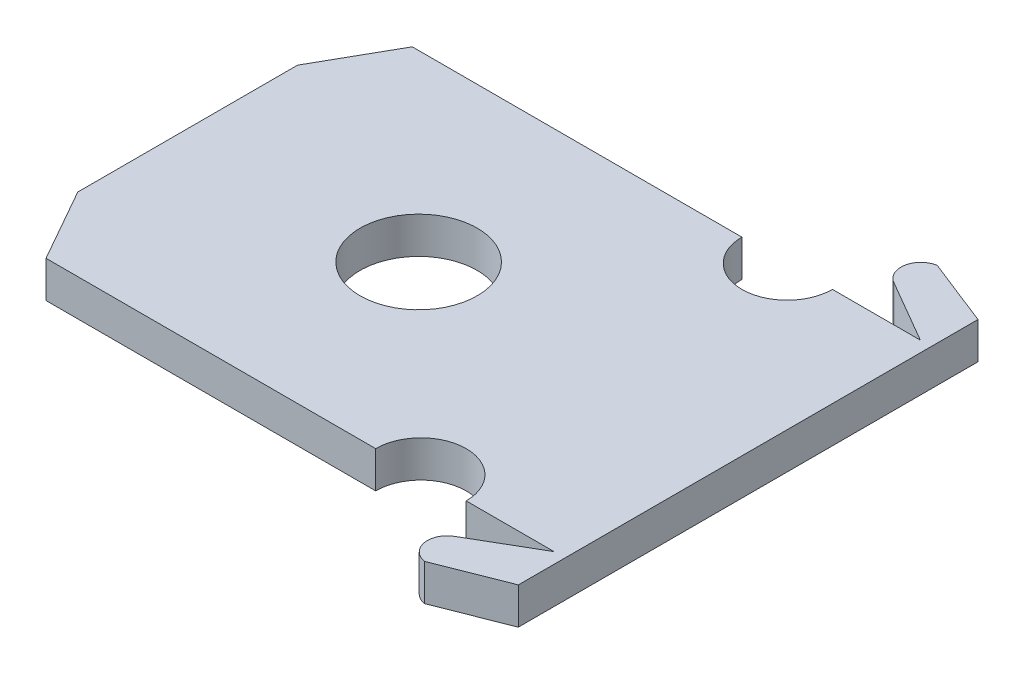
ISO-10303-21;
HEADER;
FILE_DESCRIPTION(('STEP AP214'),'2;1');
FILE_NAME('part.step','',(''),(''),'','','');
FILE_SCHEMA(('AUTOMOTIVE_DESIGN { 1 0 10303 214 1 1 1 1 }'));
ENDSEC;
DATA;
#1=APPLICATION_CONTEXT('core data for automotive mechanical design processes');
#2=APPLICATION_PROTOCOL_DEFINITION('international standard','automotive_design',2000,#1);
#3=PRODUCT_CONTEXT('',#1,'mechanical');
#4=PRODUCT('Part','Part','',(#3));
#5=PRODUCT_RELATED_PRODUCT_CATEGORY('part','',(#4));
#6=PRODUCT_DEFINITION_FORMATION('','',#4);
#7=PRODUCT_DEFINITION_CONTEXT('part definition',#1,'design');
#8=PRODUCT_DEFINITION('design','',#6,#7);
#9=PRODUCT_DEFINITION_SHAPE('','',#8);
#10=(LENGTH_UNIT() NAMED_UNIT(*) SI_UNIT(.MILLI.,.METRE.));
#11=(NAMED_UNIT(*) PLANE_ANGLE_UNIT() SI_UNIT($,.RADIAN.));
#12=(NAMED_UNIT(*) SI_UNIT($,.STERADIAN.) SOLID_ANGLE_UNIT());
#13=UNCERTAINTY_MEASURE_WITH_UNIT(LENGTH_MEASURE(1.E-05),#10,'distance_accuracy_value','');
#14=(GEOMETRIC_REPRESENTATION_CONTEXT(3) GLOBAL_UNCERTAINTY_ASSIGNED_CONTEXT((#13)) GLOBAL_UNIT_ASSIGNED_CONTEXT((#10,
#11,#12)) REPRESENTATION_CONTEXT('',''));
#15=CARTESIAN_POINT('',(0.,0.,0.));
#16=DIRECTION('',(0.,0.,1.));
#17=DIRECTION('',(1.,0.,0.));
#18=AXIS2_PLACEMENT_3D('',#15,#16,#17);
#19=CARTESIAN_POINT('',(5.68441074694422,0.5,2.5));
#20=DIRECTION('',(0.,-1.,0.));
#21=DIRECTION('',(0.,0.,-1.));
#22=AXIS2_PLACEMENT_3D('',#19,#20,#21);
#23=PLANE('',#22);
#24=DIRECTION('',(0.492828270671044,0.,0.870126597471534));
#25=VECTOR('',#24,1.);
#26=CARTESIAN_POINT('',(0.,0.5,1.5));
#27=LINE('',#26,#25);
#28=CARTESIAN_POINT('',(0.,0.5,1.5));
#29=VERTEX_POINT('',#28);
#30=CARTESIAN_POINT('',(0.566386859226157,0.5,2.5));
#31=VERTEX_POINT('',#30);
#32=EDGE_CURVE('E266',#29,#31,#27,.T.);
#33=ORIENTED_EDGE('',*,*,#32,.T.);
#34=DIRECTION('',(1.,0.,0.));
#35=VECTOR('',#34,1.);
#36=CARTESIAN_POINT('',(0.566386859226157,0.5,2.5));
#37=LINE('',#36,#35);
#38=CARTESIAN_POINT('',(5.06638685922616,0.5,2.5));
#39=VERTEX_POINT('',#38);
#40=EDGE_CURVE('E164',#31,#39,#37,.T.);
#41=ORIENTED_EDGE('',*,*,#40,.T.);
#42=CARTESIAN_POINT('',(5.68441074694422,0.5,2.5));
#43=DIRECTION('',(0.,-1.,0.));
#44=DIRECTION('',(0.,0.,-1.));
#45=AXIS2_PLACEMENT_3D('',#42,#43,#44);
#46=CIRCLE('',#45,0.618023887718066);
#47=CARTESIAN_POINT('',(6.30243463466229,0.5,2.5));
#48=VERTEX_POINT('',#47);
#49=EDGE_CURVE('E300',#39,#48,#46,.T.);
#50=ORIENTED_EDGE('',*,*,#49,.T.);
#51=DIRECTION('',(1.,0.,0.));
#52=VECTOR('',#51,1.);
#53=CARTESIAN_POINT('',(6.30243463466229,0.5,2.5));
#54=LINE('',#53,#52);
#55=CARTESIAN_POINT('',(7.50243463466229,0.5,2.5));
#56=VERTEX_POINT('',#55);
#57=EDGE_CURVE('E319',#48,#56,#54,.T.);
#58=ORIENTED_EDGE('',*,*,#57,.T.);
#59=DIRECTION('',(-0.865033947143185,0.,0.501713334773834));
#60=VECTOR('',#59,1.);
#61=CARTESIAN_POINT('',(7.50243463466229,0.5,2.5));
#62=LINE('',#61,#60);
#63=CARTESIAN_POINT('',(6.64016768675193,0.5,3.00010849554527));
#64=VERTEX_POINT('',#63);
#65=EDGE_CURVE('E316',#56,#64,#62,.T.);
#66=ORIENTED_EDGE('',*,*,#65,.T.);
#67=CARTESIAN_POINT('',(6.77527826509622,0.5,3.23306071902691));
#68=DIRECTION('',(0.,1.,0.));
#69=DIRECTION('',(0.,0.,1.));
#70=AXIS2_PLACEMENT_3D('',#67,#68,#69);
#71=CIRCLE('',#70,0.269298360198441);
#72=CARTESIAN_POINT('',(6.73312595550454,0.5,3.49903964601485));
#73=VERTEX_POINT('',#72);
#74=EDGE_CURVE('E318',#64,#73,#71,.T.);
#75=ORIENTED_EDGE('',*,*,#74,.T.);
#76=DIRECTION('',(0.930476883124397,0.,-0.3663506107148));
#77=VECTOR('',#76,1.);
#78=CARTESIAN_POINT('',(6.73312595550454,0.5,3.49903964601485));
#79=LINE('',#78,#77);
#80=CARTESIAN_POINT('',(7.65144321772771,0.5,3.13747656374275));
#81=VERTEX_POINT('',#80);
#82=EDGE_CURVE('E321',#73,#81,#79,.T.);
#83=ORIENTED_EDGE('',*,*,#82,.T.);
#84=DIRECTION('',(0.,0.,-1.));
#85=VECTOR('',#84,1.);
#86=CARTESIAN_POINT('',(7.65144321772771,0.5,3.13747656374275));
#87=LINE('',#86,#85);
#88=CARTESIAN_POINT('',(7.65144321772771,0.5,-3.13747656374275));
#89=VERTEX_POINT('',#88);
#90=EDGE_CURVE('E327',#81,#89,#87,.T.);
#91=ORIENTED_EDGE('',*,*,#90,.T.);
#92=DIRECTION('',(0.930476883124397,0.,0.3663506107148));
#93=VECTOR('',#92,1.);
#94=CARTESIAN_POINT('',(6.73312595550454,0.5,-3.49903964601485));
#95=LINE('',#94,#93);
#96=CARTESIAN_POINT('',(6.73312595550454,0.5,-3.49903964601485));
#97=VERTEX_POINT('',#96);
#98=EDGE_CURVE('E329',#97,#89,#95,.T.);
#99=ORIENTED_EDGE('',*,*,#98,.F.);
#100=CARTESIAN_POINT('',(6.77527826509622,0.5,-3.23306071902691));
#101=DIRECTION('',(0.,-1.,0.));
#102=DIRECTION('',(0.,0.,-1.));
#103=AXIS2_PLACEMENT_3D('',#100,#101,#102);
#104=CIRCLE('',#103,0.269298360198441);
#105=CARTESIAN_POINT('',(6.64016768675193,0.5,-3.00010849554527));
#106=VERTEX_POINT('',#105);
#107=EDGE_CURVE('E332',#106,#97,#104,.T.);
#108=ORIENTED_EDGE('',*,*,#107,.F.);
#109=DIRECTION('',(-0.865033947143185,0.,-0.501713334773834));
#110=VECTOR('',#109,1.);
#111=CARTESIAN_POINT('',(7.50243463466229,0.5,-2.5));
#112=LINE('',#111,#110);
#113=CARTESIAN_POINT('',(7.50243463466229,0.5,-2.5));
#114=VERTEX_POINT('',#113);
#115=EDGE_CURVE('E335',#114,#106,#112,.T.);
#116=ORIENTED_EDGE('',*,*,#115,.F.);
#117=DIRECTION('',(1.,0.,0.));
#118=VECTOR('',#117,1.);
#119=CARTESIAN_POINT('',(6.30243463466229,0.5,-2.5));
#120=LINE('',#119,#118);
#121=CARTESIAN_POINT('',(6.30243463466229,0.5,-2.5));
#122=VERTEX_POINT('',#121);
#123=EDGE_CURVE('E338',#122,#114,#120,.T.);
#124=ORIENTED_EDGE('',*,*,#123,.F.);
#125=CARTESIAN_POINT('',(5.68441074694422,0.5,-2.5));
#126=DIRECTION('',(0.,1.,0.));
#127=DIRECTION('',(0.,0.,1.));
#128=AXIS2_PLACEMENT_3D('',#125,#126,#127);
#129=CIRCLE('',#128,0.618023887718066);
#130=CARTESIAN_POINT('',(5.06638685922616,0.5,-2.5));
#131=VERTEX_POINT('',#130);
#132=EDGE_CURVE('E220',#131,#122,#129,.T.);
#133=ORIENTED_EDGE('',*,*,#132,.F.);
#134=DIRECTION('',(1.,0.,0.));
#135=VECTOR('',#134,1.);
#136=CARTESIAN_POINT('',(0.566386859226156,0.5,-2.5));
#137=LINE('',#136,#135);
#138=CARTESIAN_POINT('',(0.566386859226156,0.5,-2.5));
#139=VERTEX_POINT('',#138);
#140=EDGE_CURVE('E206',#139,#131,#137,.T.);
#141=ORIENTED_EDGE('',*,*,#140,.F.);
#142=DIRECTION('',(0.492828270671044,0.,-0.870126597471534));
#143=VECTOR('',#142,1.);
#144=CARTESIAN_POINT('',(0.,0.5,-1.5));
#145=LINE('',#144,#143);
#146=CARTESIAN_POINT('',(0.,0.5,-1.5));
#147=VERTEX_POINT('',#146);
#148=EDGE_CURVE('E217',#147,#139,#145,.T.);
#149=ORIENTED_EDGE('',*,*,#148,.F.);
#150=DIRECTION('',(0.,0.,1.));
#151=VECTOR('',#150,1.);
#152=CARTESIAN_POINT('',(0.,0.5,-1.5));
#153=LINE('',#152,#151);
#154=EDGE_CURVE('E101',#147,#29,#153,.T.);
#155=ORIENTED_EDGE('',*,*,#154,.T.);
#156=EDGE_LOOP('',(#33,#41,#50,#58,#66,#75,#83,#91,#99,#108,#116,#124,#133,#141,#149,#155));
#157=FACE_BOUND('',#156,.T.);
#158=CARTESIAN_POINT('',(3.15336684306544,0.5,0.));
#159=DIRECTION('',(0.,1.,0.));
#160=DIRECTION('',(0.,0.,1.));
#161=AXIS2_PLACEMENT_3D('',#158,#159,#160);
#162=CIRCLE('',#161,0.800000000000001);
#163=CARTESIAN_POINT('',(3.15336684306544,0.5,0.8));
#164=VERTEX_POINT('',#163);
#165=EDGE_CURVE('E232',#164,#164,#162,.T.);
#166=ORIENTED_EDGE('',*,*,#165,.F.);
#167=EDGE_LOOP('',(#166));
#168=FACE_BOUND('',#167,.T.);
#169=ADVANCED_FACE('F84',(#157,#168),#23,.F.);
#170=CARTESIAN_POINT('',(5.68441074694422,0.,2.5));
#171=DIRECTION('',(0.,-1.,0.));
#172=DIRECTION('',(0.,0.,-1.));
#173=AXIS2_PLACEMENT_3D('',#170,#171,#172);
#174=PLANE('',#173);
#175=DIRECTION('',(0.492828270671044,0.,0.870126597471534));
#176=VECTOR('',#175,1.);
#177=CARTESIAN_POINT('',(0.,0.,1.5));
#178=LINE('',#177,#176);
#179=CARTESIAN_POINT('',(0.,0.,1.5));
#180=VERTEX_POINT('',#179);
#181=CARTESIAN_POINT('',(0.566386859226157,0.,2.5));
#182=VERTEX_POINT('',#181);
#183=EDGE_CURVE('E228',#180,#182,#178,.T.);
#184=ORIENTED_EDGE('',*,*,#183,.F.);
#185=DIRECTION('',(0.,0.,1.));
#186=VECTOR('',#185,1.);
#187=CARTESIAN_POINT('',(0.,0.,-1.5));
#188=LINE('',#187,#186);
#189=CARTESIAN_POINT('',(0.,0.,-1.5));
#190=VERTEX_POINT('',#189);
#191=EDGE_CURVE('E156',#190,#180,#188,.T.);
#192=ORIENTED_EDGE('',*,*,#191,.F.);
#193=DIRECTION('',(0.492828270671044,0.,-0.870126597471534));
#194=VECTOR('',#193,1.);
#195=CARTESIAN_POINT('',(0.,0.,-1.5));
#196=LINE('',#195,#194);
#197=CARTESIAN_POINT('',(0.566386859226156,0.,-2.5));
#198=VERTEX_POINT('',#197);
#199=EDGE_CURVE('E263',#190,#198,#196,.T.);
#200=ORIENTED_EDGE('',*,*,#199,.T.);
#201=DIRECTION('',(1.,0.,0.));
#202=VECTOR('',#201,1.);
#203=CARTESIAN_POINT('',(0.566386859226156,0.,-2.5));
#204=LINE('',#203,#202);
#205=CARTESIAN_POINT('',(5.06638685922616,0.,-2.5));
#206=VERTEX_POINT('',#205);
#207=EDGE_CURVE('E208',#198,#206,#204,.T.);
#208=ORIENTED_EDGE('',*,*,#207,.T.);
#209=CARTESIAN_POINT('',(5.68441074694422,0.,-2.5));
#210=DIRECTION('',(0.,1.,0.));
#211=DIRECTION('',(0.,0.,1.));
#212=AXIS2_PLACEMENT_3D('',#209,#210,#211);
#213=CIRCLE('',#212,0.618023887718066);
#214=CARTESIAN_POINT('',(6.30243463466229,0.,-2.5));
#215=VERTEX_POINT('',#214);
#216=EDGE_CURVE('E259',#206,#215,#213,.T.);
#217=ORIENTED_EDGE('',*,*,#216,.T.);
#218=DIRECTION('',(1.,0.,0.));
#219=VECTOR('',#218,1.);
#220=CARTESIAN_POINT('',(6.30243463466229,0.,-2.5));
#221=LINE('',#220,#219);
#222=CARTESIAN_POINT('',(7.50243463466229,0.,-2.5));
#223=VERTEX_POINT('',#222);
#224=EDGE_CURVE('E256',#215,#223,#221,.T.);
#225=ORIENTED_EDGE('',*,*,#224,.T.);
#226=DIRECTION('',(-0.865033947143185,0.,-0.501713334773834));
#227=VECTOR('',#226,1.);
#228=CARTESIAN_POINT('',(7.50243463466229,0.,-2.5));
#229=LINE('',#228,#227);
#230=CARTESIAN_POINT('',(6.64016768675193,0.,-3.00010849554527));
#231=VERTEX_POINT('',#230);
#232=EDGE_CURVE('E253',#223,#231,#229,.T.);
#233=ORIENTED_EDGE('',*,*,#232,.T.);
#234=CARTESIAN_POINT('',(6.77527826509622,0.,-3.23306071902691));
#235=DIRECTION('',(0.,-1.,0.));
#236=DIRECTION('',(0.,0.,-1.));
#237=AXIS2_PLACEMENT_3D('',#234,#235,#236);
#238=CIRCLE('',#237,0.269298360198441);
#239=CARTESIAN_POINT('',(6.73312595550454,0.,-3.49903964601485));
#240=VERTEX_POINT('',#239);
#241=EDGE_CURVE('E250',#231,#240,#238,.T.);
#242=ORIENTED_EDGE('',*,*,#241,.T.);
#243=DIRECTION('',(0.930476883124397,0.,0.3663506107148));
#244=VECTOR('',#243,1.);
#245=CARTESIAN_POINT('',(6.73312595550454,0.,-3.49903964601485));
#246=LINE('',#245,#244);
#247=CARTESIAN_POINT('',(7.65144321772771,0.,-3.13747656374275));
#248=VERTEX_POINT('',#247);
#249=EDGE_CURVE('E247',#240,#248,#246,.T.);
#250=ORIENTED_EDGE('',*,*,#249,.T.);
#251=DIRECTION('',(0.,0.,-1.));
#252=VECTOR('',#251,1.);
#253=CARTESIAN_POINT('',(7.65144321772771,0.,3.13747656374275));
#254=LINE('',#253,#252);
#255=CARTESIAN_POINT('',(7.65144321772771,0.,3.13747656374275));
#256=VERTEX_POINT('',#255);
#257=EDGE_CURVE('E244',#256,#248,#254,.T.);
#258=ORIENTED_EDGE('',*,*,#257,.F.);
#259=DIRECTION('',(0.930476883124397,0.,-0.3663506107148));
#260=VECTOR('',#259,1.);
#261=CARTESIAN_POINT('',(6.73312595550454,0.,3.49903964601485));
#262=LINE('',#261,#260);
#263=CARTESIAN_POINT('',(6.73312595550454,0.,3.49903964601485));
#264=VERTEX_POINT('',#263);
#265=EDGE_CURVE('E242',#264,#256,#262,.T.);
#266=ORIENTED_EDGE('',*,*,#265,.F.);
#267=CARTESIAN_POINT('',(6.77527826509622,0.,3.23306071902691));
#268=DIRECTION('',(0.,1.,0.));
#269=DIRECTION('',(0.,0.,1.));
#270=AXIS2_PLACEMENT_3D('',#267,#268,#269);
#271=CIRCLE('',#270,0.269298360198441);
#272=CARTESIAN_POINT('',(6.64016768675193,0.,3.00010849554527));
#273=VERTEX_POINT('',#272);
#274=EDGE_CURVE('E240',#273,#264,#271,.T.);
#275=ORIENTED_EDGE('',*,*,#274,.F.);
#276=DIRECTION('',(-0.865033947143185,0.,0.501713334773834));
#277=VECTOR('',#276,1.);
#278=CARTESIAN_POINT('',(7.50243463466229,0.,2.5));
#279=LINE('',#278,#277);
#280=CARTESIAN_POINT('',(7.50243463466229,0.,2.5));
#281=VERTEX_POINT('',#280);
#282=EDGE_CURVE('E238',#281,#273,#279,.T.);
#283=ORIENTED_EDGE('',*,*,#282,.F.);
#284=DIRECTION('',(1.,0.,0.));
#285=VECTOR('',#284,1.);
#286=CARTESIAN_POINT('',(6.30243463466229,0.,2.5));
#287=LINE('',#286,#285);
#288=CARTESIAN_POINT('',(6.30243463466229,0.,2.5));
#289=VERTEX_POINT('',#288);
#290=EDGE_CURVE('E236',#289,#281,#287,.T.);
#291=ORIENTED_EDGE('',*,*,#290,.F.);
#292=CARTESIAN_POINT('',(5.68441074694422,0.,2.5));
#293=DIRECTION('',(0.,-1.,0.));
#294=DIRECTION('',(0.,0.,-1.));
#295=AXIS2_PLACEMENT_3D('',#292,#293,#294);
#296=CIRCLE('',#295,0.618023887718066);
#297=CARTESIAN_POINT('',(5.06638685922616,0.,2.5));
#298=VERTEX_POINT('',#297);
#299=EDGE_CURVE('E234',#298,#289,#296,.T.);
#300=ORIENTED_EDGE('',*,*,#299,.F.);
#301=DIRECTION('',(1.,0.,0.));
#302=VECTOR('',#301,1.);
#303=CARTESIAN_POINT('',(0.566386859226157,0.,2.5));
#304=LINE('',#303,#302);
#305=EDGE_CURVE('E231',#182,#298,#304,.T.);
#306=ORIENTED_EDGE('',*,*,#305,.F.);
#307=EDGE_LOOP('',(#184,#192,#200,#208,#217,#225,#233,#242,#250,#258,#266,#275,#283,#291,#300,#306));
#308=FACE_BOUND('',#307,.T.);
#309=CARTESIAN_POINT('',(3.15336684306544,0.,0.));
#310=DIRECTION('',(0.,1.,0.));
#311=DIRECTION('',(0.,0.,1.));
#312=AXIS2_PLACEMENT_3D('',#309,#310,#311);
#313=CIRCLE('',#312,0.800000000000001);
#314=CARTESIAN_POINT('',(3.15336684306544,0.,0.8));
#315=VERTEX_POINT('',#314);
#316=EDGE_CURVE('E539',#315,#315,#313,.T.);
#317=ORIENTED_EDGE('',*,*,#316,.T.);
#318=EDGE_LOOP('',(#317));
#319=FACE_BOUND('',#318,.T.);
#320=ADVANCED_FACE('F304',(#308,#319),#174,.T.);
#321=CARTESIAN_POINT('',(0.,0.5,1.5));
#322=DIRECTION('',(0.870126597471534,0.,-0.492828270671044));
#323=DIRECTION('',(-0.492828270671044,0.,-0.870126597471534));
#324=AXIS2_PLACEMENT_3D('',#321,#322,#323);
#325=PLANE('',#324);
#326=ORIENTED_EDGE('',*,*,#183,.T.);
#327=DIRECTION('',(0.,-1.,0.));
#328=VECTOR('',#327,1.);
#329=CARTESIAN_POINT('',(0.566386859226157,0.5,2.5));
#330=LINE('',#329,#328);
#331=EDGE_CURVE('E12',#31,#182,#330,.T.);
#332=ORIENTED_EDGE('',*,*,#331,.F.);
#333=ORIENTED_EDGE('',*,*,#32,.F.);
#334=DIRECTION('',(0.,-1.,0.));
#335=VECTOR('',#334,1.);
#336=CARTESIAN_POINT('',(0.,0.5,1.5));
#337=LINE('',#336,#335);
#338=EDGE_CURVE('E224',#29,#180,#337,.T.);
#339=ORIENTED_EDGE('',*,*,#338,.T.);
#340=EDGE_LOOP('',(#326,#332,#333,#339));
#341=FACE_BOUND('',#340,.T.);
#342=ADVANCED_FACE('F86',(#341),#325,.F.);
#343=CARTESIAN_POINT('',(0.566386859226157,0.5,2.5));
#344=DIRECTION('',(0.,0.,-1.));
#345=DIRECTION('',(-1.,0.,0.));
#346=AXIS2_PLACEMENT_3D('',#343,#344,#345);
#347=PLANE('',#346);
#348=ORIENTED_EDGE('',*,*,#305,.T.);
#349=DIRECTION('',(0.,-1.,0.));
#350=VECTOR('',#349,1.);
#351=CARTESIAN_POINT('',(5.06638685922616,0.5,2.5));
#352=LINE('',#351,#350);
#353=EDGE_CURVE('E93',#39,#298,#352,.T.);
#354=ORIENTED_EDGE('',*,*,#353,.F.);
#355=ORIENTED_EDGE('',*,*,#40,.F.);
#356=ORIENTED_EDGE('',*,*,#331,.T.);
#357=EDGE_LOOP('',(#348,#354,#355,#356));
#358=FACE_BOUND('',#357,.T.);
#359=ADVANCED_FACE('F367',(#358),#347,.F.);
#360=CARTESIAN_POINT('',(5.68441074694422,0.5,2.5));
#361=DIRECTION('',(0.,-1.,0.));
#362=DIRECTION('',(0.,0.,-1.));
#363=AXIS2_PLACEMENT_3D('',#360,#361,#362);
#364=CYLINDRICAL_SURFACE('',#363,0.618023887718066);
#365=ORIENTED_EDGE('',*,*,#299,.T.);
#366=DIRECTION('',(0.,-1.,0.));
#367=VECTOR('',#366,1.);
#368=CARTESIAN_POINT('',(6.30243463466229,0.5,2.5));
#369=LINE('',#368,#367);
#370=EDGE_CURVE('E292',#48,#289,#369,.T.);
#371=ORIENTED_EDGE('',*,*,#370,.F.);
#372=ORIENTED_EDGE('',*,*,#49,.F.);
#373=ORIENTED_EDGE('',*,*,#353,.T.);
#374=EDGE_LOOP('',(#365,#371,#372,#373));
#375=FACE_BOUND('',#374,.T.);
#376=ADVANCED_FACE('F298',(#375),#364,.F.);
#377=CARTESIAN_POINT('',(6.30243463466229,0.5,2.5));
#378=DIRECTION('',(0.,0.,-1.));
#379=DIRECTION('',(-1.,0.,0.));
#380=AXIS2_PLACEMENT_3D('',#377,#378,#379);
#381=PLANE('',#380);
#382=ORIENTED_EDGE('',*,*,#290,.T.);
#383=DIRECTION('',(0.,-1.,0.));
#384=VECTOR('',#383,1.);
#385=CARTESIAN_POINT('',(7.50243463466229,0.5,2.5));
#386=LINE('',#385,#384);
#387=EDGE_CURVE('E289',#56,#281,#386,.T.);
#388=ORIENTED_EDGE('',*,*,#387,.F.);
#389=ORIENTED_EDGE('',*,*,#57,.F.);
#390=ORIENTED_EDGE('',*,*,#370,.T.);
#391=EDGE_LOOP('',(#382,#388,#389,#390));
#392=FACE_BOUND('',#391,.T.);
#393=ADVANCED_FACE('F310',(#392),#381,.F.);
#394=CARTESIAN_POINT('',(7.50243463466229,0.5,2.5));
#395=DIRECTION('',(0.501713334773834,0.,0.865033947143185));
#396=DIRECTION('',(0.865033947143185,0.,-0.501713334773834));
#397=AXIS2_PLACEMENT_3D('',#394,#395,#396);
#398=PLANE('',#397);
#399=ORIENTED_EDGE('',*,*,#282,.T.);
#400=DIRECTION('',(0.,-1.,0.));
#401=VECTOR('',#400,1.);
#402=CARTESIAN_POINT('',(6.64016768675193,0.5,3.00010849554527));
#403=LINE('',#402,#401);
#404=EDGE_CURVE('E286',#64,#273,#403,.T.);
#405=ORIENTED_EDGE('',*,*,#404,.F.);
#406=ORIENTED_EDGE('',*,*,#65,.F.);
#407=ORIENTED_EDGE('',*,*,#387,.T.);
#408=EDGE_LOOP('',(#399,#405,#406,#407));
#409=FACE_BOUND('',#408,.T.);
#410=ADVANCED_FACE('F314',(#409),#398,.F.);
#411=CARTESIAN_POINT('',(6.77527826509622,0.5,3.23306071902691));
#412=DIRECTION('',(0.,-1.,0.));
#413=DIRECTION('',(0.,0.,-1.));
#414=AXIS2_PLACEMENT_3D('',#411,#412,#413);
#415=CYLINDRICAL_SURFACE('',#414,0.269298360198441);
#416=ORIENTED_EDGE('',*,*,#274,.T.);
#417=DIRECTION('',(0.,-1.,0.));
#418=VECTOR('',#417,1.);
#419=CARTESIAN_POINT('',(6.73312595550454,0.5,3.49903964601485));
#420=LINE('',#419,#418);
#421=EDGE_CURVE('E283',#73,#264,#420,.T.);
#422=ORIENTED_EDGE('',*,*,#421,.F.);
#423=ORIENTED_EDGE('',*,*,#74,.F.);
#424=ORIENTED_EDGE('',*,*,#404,.T.);
#425=EDGE_LOOP('',(#416,#422,#423,#424));
#426=FACE_BOUND('',#425,.T.);
#427=ADVANCED_FACE('F380',(#426),#415,.T.);
#428=CARTESIAN_POINT('',(6.73312595550454,0.5,3.49903964601485));
#429=DIRECTION('',(-0.3663506107148,0.,-0.930476883124397));
#430=DIRECTION('',(-0.930476883124397,0.,0.3663506107148));
#431=AXIS2_PLACEMENT_3D('',#428,#429,#430);
#432=PLANE('',#431);
#433=ORIENTED_EDGE('',*,*,#265,.T.);
#434=DIRECTION('',(0.,-1.,0.));
#435=VECTOR('',#434,1.);
#436=CARTESIAN_POINT('',(7.65144321772771,0.5,3.13747656374275));
#437=LINE('',#436,#435);
#438=EDGE_CURVE('E280',#81,#256,#437,.T.);
#439=ORIENTED_EDGE('',*,*,#438,.F.);
#440=ORIENTED_EDGE('',*,*,#82,.F.);
#441=ORIENTED_EDGE('',*,*,#421,.T.);
#442=EDGE_LOOP('',(#433,#439,#440,#441));
#443=FACE_BOUND('',#442,.T.);
#444=ADVANCED_FACE('F383',(#443),#432,.F.);
#445=CARTESIAN_POINT('',(7.65144321772771,0.5,3.13747656374275));
#446=DIRECTION('',(-1.,0.,0.));
#447=DIRECTION('',(0.,0.,1.));
#448=AXIS2_PLACEMENT_3D('',#445,#446,#447);
#449=PLANE('',#448);
#450=ORIENTED_EDGE('',*,*,#257,.T.);
#451=DIRECTION('',(0.,-1.,0.));
#452=VECTOR('',#451,1.);
#453=CARTESIAN_POINT('',(7.65144321772771,0.5,-3.13747656374275));
#454=LINE('',#453,#452);
#455=EDGE_CURVE('E278',#89,#248,#454,.T.);
#456=ORIENTED_EDGE('',*,*,#455,.F.);
#457=ORIENTED_EDGE('',*,*,#90,.F.);
#458=ORIENTED_EDGE('',*,*,#438,.T.);
#459=EDGE_LOOP('',(#450,#456,#457,#458));
#460=FACE_BOUND('',#459,.T.);
#461=ADVANCED_FACE('F387',(#460),#449,.F.);
#462=CARTESIAN_POINT('',(6.73312595550454,0.5,-3.49903964601485));
#463=DIRECTION('',(0.3663506107148,0.,-0.930476883124397));
#464=DIRECTION('',(-0.930476883124397,0.,-0.3663506107148));
#465=AXIS2_PLACEMENT_3D('',#462,#463,#464);
#466=PLANE('',#465);
#467=ORIENTED_EDGE('',*,*,#249,.F.);
#468=DIRECTION('',(0.,-1.,0.));
#469=VECTOR('',#468,1.);
#470=CARTESIAN_POINT('',(6.73312595550454,0.5,-3.49903964601485));
#471=LINE('',#470,#469);
#472=EDGE_CURVE('E276',#97,#240,#471,.T.);
#473=ORIENTED_EDGE('',*,*,#472,.F.);
#474=ORIENTED_EDGE('',*,*,#98,.T.);
#475=ORIENTED_EDGE('',*,*,#455,.T.);
#476=EDGE_LOOP('',(#467,#473,#474,#475));
#477=FACE_BOUND('',#476,.T.);
#478=ADVANCED_FACE('F391',(#477),#466,.T.);
#479=CARTESIAN_POINT('',(6.77527826509622,0.5,-3.23306071902691));
#480=DIRECTION('',(0.,-1.,0.));
#481=DIRECTION('',(0.,0.,-1.));
#482=AXIS2_PLACEMENT_3D('',#479,#480,#481);
#483=CYLINDRICAL_SURFACE('',#482,0.269298360198441);
#484=ORIENTED_EDGE('',*,*,#241,.F.);
#485=DIRECTION('',(0.,-1.,0.));
#486=VECTOR('',#485,1.);
#487=CARTESIAN_POINT('',(6.64016768675193,0.5,-3.00010849554527));
#488=LINE('',#487,#486);
#489=EDGE_CURVE('E274',#106,#231,#488,.T.);
#490=ORIENTED_EDGE('',*,*,#489,.F.);
#491=ORIENTED_EDGE('',*,*,#107,.T.);
#492=ORIENTED_EDGE('',*,*,#472,.T.);
#493=EDGE_LOOP('',(#484,#490,#491,#492));
#494=FACE_BOUND('',#493,.T.);
#495=ADVANCED_FACE('F395',(#494),#483,.T.);
#496=CARTESIAN_POINT('',(7.50243463466229,0.5,-2.5));
#497=DIRECTION('',(-0.501713334773834,0.,0.865033947143185));
#498=DIRECTION('',(0.865033947143185,0.,0.501713334773834));
#499=AXIS2_PLACEMENT_3D('',#496,#497,#498);
#500=PLANE('',#499);
#501=ORIENTED_EDGE('',*,*,#232,.F.);
#502=DIRECTION('',(0.,-1.,0.));
#503=VECTOR('',#502,1.);
#504=CARTESIAN_POINT('',(7.50243463466229,0.5,-2.5));
#505=LINE('',#504,#503);
#506=EDGE_CURVE('E272',#114,#223,#505,.T.);
#507=ORIENTED_EDGE('',*,*,#506,.F.);
#508=ORIENTED_EDGE('',*,*,#115,.T.);
#509=ORIENTED_EDGE('',*,*,#489,.T.);
#510=EDGE_LOOP('',(#501,#507,#508,#509));
#511=FACE_BOUND('',#510,.T.);
#512=ADVANCED_FACE('F399',(#511),#500,.T.);
#513=CARTESIAN_POINT('',(6.30243463466229,0.5,-2.5));
#514=DIRECTION('',(0.,0.,-1.));
#515=DIRECTION('',(-1.,0.,0.));
#516=AXIS2_PLACEMENT_3D('',#513,#514,#515);
#517=PLANE('',#516);
#518=ORIENTED_EDGE('',*,*,#224,.F.);
#519=DIRECTION('',(0.,-1.,0.));
#520=VECTOR('',#519,1.);
#521=CARTESIAN_POINT('',(6.30243463466229,0.5,-2.5));
#522=LINE('',#521,#520);
#523=EDGE_CURVE('E270',#122,#215,#522,.T.);
#524=ORIENTED_EDGE('',*,*,#523,.F.);
#525=ORIENTED_EDGE('',*,*,#123,.T.);
#526=ORIENTED_EDGE('',*,*,#506,.T.);
#527=EDGE_LOOP('',(#518,#524,#525,#526));
#528=FACE_BOUND('',#527,.T.);
#529=ADVANCED_FACE('F403',(#528),#517,.T.);
#530=CARTESIAN_POINT('',(5.68441074694422,0.5,-2.5));
#531=DIRECTION('',(0.,-1.,0.));
#532=DIRECTION('',(0.,0.,-1.));
#533=AXIS2_PLACEMENT_3D('',#530,#531,#532);
#534=CYLINDRICAL_SURFACE('',#533,0.618023887718066);
#535=ORIENTED_EDGE('',*,*,#216,.F.);
#536=DIRECTION('',(0.,-1.,0.));
#537=VECTOR('',#536,1.);
#538=CARTESIAN_POINT('',(5.06638685922616,0.5,-2.5));
#539=LINE('',#538,#537);
#540=EDGE_CURVE('E213',#131,#206,#539,.T.);
#541=ORIENTED_EDGE('',*,*,#540,.F.);
#542=ORIENTED_EDGE('',*,*,#132,.T.);
#543=ORIENTED_EDGE('',*,*,#523,.T.);
#544=EDGE_LOOP('',(#535,#541,#542,#543));
#545=FACE_BOUND('',#544,.T.);
#546=ADVANCED_FACE('F342',(#545),#534,.F.);
#547=CARTESIAN_POINT('',(0.566386859226156,0.5,-2.5));
#548=DIRECTION('',(0.,0.,-1.));
#549=DIRECTION('',(-1.,0.,0.));
#550=AXIS2_PLACEMENT_3D('',#547,#548,#549);
#551=PLANE('',#550);
#552=ORIENTED_EDGE('',*,*,#207,.F.);
#553=DIRECTION('',(0.,-1.,0.));
#554=VECTOR('',#553,1.);
#555=CARTESIAN_POINT('',(0.566386859226156,0.5,-2.5));
#556=LINE('',#555,#554);
#557=EDGE_CURVE('E203',#139,#198,#556,.T.);
#558=ORIENTED_EDGE('',*,*,#557,.F.);
#559=ORIENTED_EDGE('',*,*,#140,.T.);
#560=ORIENTED_EDGE('',*,*,#540,.T.);
#561=EDGE_LOOP('',(#552,#558,#559,#560));
#562=FACE_BOUND('',#561,.T.);
#563=ADVANCED_FACE('F205',(#562),#551,.T.);
#564=CARTESIAN_POINT('',(0.,0.5,-1.5));
#565=DIRECTION('',(-0.870126597471534,0.,-0.492828270671044));
#566=DIRECTION('',(-0.492828270671044,0.,0.870126597471534));
#567=AXIS2_PLACEMENT_3D('',#564,#565,#566);
#568=PLANE('',#567);
#569=ORIENTED_EDGE('',*,*,#199,.F.);
#570=DIRECTION('',(0.,-1.,0.));
#571=VECTOR('',#570,1.);
#572=CARTESIAN_POINT('',(0.,0.5,-1.5));
#573=LINE('',#572,#571);
#574=EDGE_CURVE('E153',#147,#190,#573,.T.);
#575=ORIENTED_EDGE('',*,*,#574,.F.);
#576=ORIENTED_EDGE('',*,*,#148,.T.);
#577=ORIENTED_EDGE('',*,*,#557,.T.);
#578=EDGE_LOOP('',(#569,#575,#576,#577));
#579=FACE_BOUND('',#578,.T.);
#580=ADVANCED_FACE('F222',(#579),#568,.T.);
#581=CARTESIAN_POINT('',(0.,0.5,-1.5));
#582=DIRECTION('',(1.,0.,0.));
#583=DIRECTION('',(0.,0.,-1.));
#584=AXIS2_PLACEMENT_3D('',#581,#582,#583);
#585=PLANE('',#584);
#586=ORIENTED_EDGE('',*,*,#191,.T.);
#587=ORIENTED_EDGE('',*,*,#338,.F.);
#588=ORIENTED_EDGE('',*,*,#154,.F.);
#589=ORIENTED_EDGE('',*,*,#574,.T.);
#590=EDGE_LOOP('',(#586,#587,#588,#589));
#591=FACE_BOUND('',#590,.T.);
#592=ADVANCED_FACE('F347',(#591),#585,.F.);
#593=CARTESIAN_POINT('',(3.15336684306544,0.5,0.));
#594=DIRECTION('',(0.,-1.,0.));
#595=DIRECTION('',(0.,0.,-1.));
#596=AXIS2_PLACEMENT_3D('',#593,#594,#595);
#597=CYLINDRICAL_SURFACE('',#596,0.800000000000001);
#598=ORIENTED_EDGE('',*,*,#165,.T.);
#599=EDGE_LOOP('',(#598));
#600=FACE_BOUND('',#599,.T.);
#601=ORIENTED_EDGE('',*,*,#316,.F.);
#602=EDGE_LOOP('',(#601));
#603=FACE_BOUND('',#602,.T.);
#604=ADVANCED_FACE('F349',(#600,#603),#597,.F.);
#605=CLOSED_SHELL('',(#169,#320,#342,#359,#376,#393,#410,#427,#444,#461,#478,#495,#512,#529,
#546,#563,#580,#592,#604));
#606=MANIFOLD_SOLID_BREP('B2',#605);
#607=ADVANCED_BREP_SHAPE_REPRESENTATION('',(#18,#606),#14);
#608=SHAPE_DEFINITION_REPRESENTATION(#9,#607);
ENDSEC;
END-ISO-10303-21;
